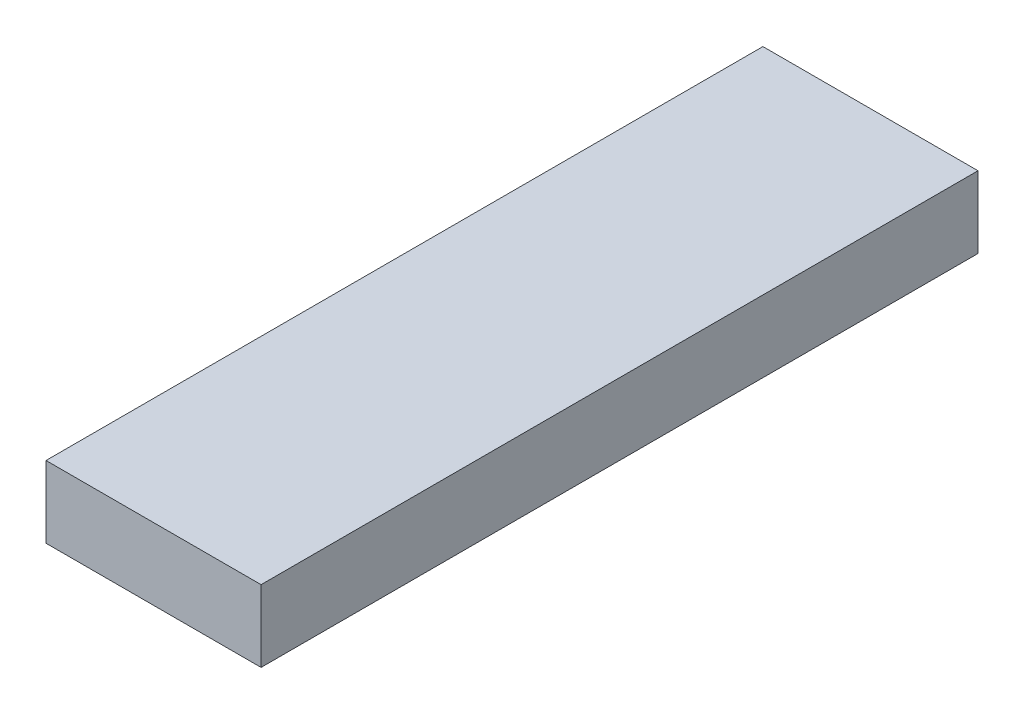
ISO-10303-21;
HEADER;
FILE_DESCRIPTION(('STEP AP214'),'2;1');
FILE_NAME('part.step','',(''),(''),'','','');
FILE_SCHEMA(('AUTOMOTIVE_DESIGN { 1 0 10303 214 1 1 1 1 }'));
ENDSEC;
DATA;
#1=APPLICATION_CONTEXT('core data for automotive mechanical design processes');
#2=APPLICATION_PROTOCOL_DEFINITION('international standard','automotive_design',2000,#1);
#3=PRODUCT_CONTEXT('',#1,'mechanical');
#4=PRODUCT('Part','Part','',(#3));
#5=PRODUCT_RELATED_PRODUCT_CATEGORY('part','',(#4));
#6=PRODUCT_DEFINITION_FORMATION('','',#4);
#7=PRODUCT_DEFINITION_CONTEXT('part definition',#1,'design');
#8=PRODUCT_DEFINITION('design','',#6,#7);
#9=PRODUCT_DEFINITION_SHAPE('','',#8);
#10=(LENGTH_UNIT() NAMED_UNIT(*) SI_UNIT(.MILLI.,.METRE.));
#11=(NAMED_UNIT(*) PLANE_ANGLE_UNIT() SI_UNIT($,.RADIAN.));
#12=(NAMED_UNIT(*) SI_UNIT($,.STERADIAN.) SOLID_ANGLE_UNIT());
#13=UNCERTAINTY_MEASURE_WITH_UNIT(LENGTH_MEASURE(1.E-05),#10,'distance_accuracy_value','');
#14=(GEOMETRIC_REPRESENTATION_CONTEXT(3) GLOBAL_UNCERTAINTY_ASSIGNED_CONTEXT((#13)) GLOBAL_UNIT_ASSIGNED_CONTEXT((#10,
#11,#12)) REPRESENTATION_CONTEXT('',''));
#15=CARTESIAN_POINT('',(0.,0.,0.));
#16=DIRECTION('',(0.,0.,1.));
#17=DIRECTION('',(1.,0.,0.));
#18=AXIS2_PLACEMENT_3D('',#15,#16,#17);
#19=CARTESIAN_POINT('',(90.,-30.,600.));
#20=DIRECTION('',(-1.,0.,0.));
#21=DIRECTION('',(0.,0.,1.));
#22=AXIS2_PLACEMENT_3D('',#19,#20,#21);
#23=PLANE('',#22);
#24=DIRECTION('',(0.,1.,0.));
#25=VECTOR('',#24,1.);
#26=CARTESIAN_POINT('',(90.,-30.,0.));
#27=LINE('',#26,#25);
#28=CARTESIAN_POINT('',(90.,-30.,0.));
#29=VERTEX_POINT('',#28);
#30=CARTESIAN_POINT('',(90.,30.,0.));
#31=VERTEX_POINT('',#30);
#32=EDGE_CURVE('E98',#29,#31,#27,.T.);
#33=ORIENTED_EDGE('',*,*,#32,.T.);
#34=DIRECTION('',(0.,0.,-1.));
#35=VECTOR('',#34,1.);
#36=CARTESIAN_POINT('',(90.,30.,600.));
#37=LINE('',#36,#35);
#38=CARTESIAN_POINT('',(90.,30.,600.));
#39=VERTEX_POINT('',#38);
#40=EDGE_CURVE('E11',#39,#31,#37,.T.);
#41=ORIENTED_EDGE('',*,*,#40,.F.);
#42=DIRECTION('',(0.,1.,0.));
#43=VECTOR('',#42,1.);
#44=CARTESIAN_POINT('',(90.,-30.,600.));
#45=LINE('',#44,#43);
#46=CARTESIAN_POINT('',(90.,-30.,600.));
#47=VERTEX_POINT('',#46);
#48=EDGE_CURVE('E86',#47,#39,#45,.T.);
#49=ORIENTED_EDGE('',*,*,#48,.F.);
#50=DIRECTION('',(0.,0.,-1.));
#51=VECTOR('',#50,1.);
#52=CARTESIAN_POINT('',(90.,-30.,600.));
#53=LINE('',#52,#51);
#54=EDGE_CURVE('E94',#47,#29,#53,.T.);
#55=ORIENTED_EDGE('',*,*,#54,.T.);
#56=EDGE_LOOP('',(#33,#41,#49,#55));
#57=FACE_BOUND('',#56,.T.);
#58=ADVANCED_FACE('F35',(#57),#23,.F.);
#59=CARTESIAN_POINT('',(-90.,30.,600.));
#60=DIRECTION('',(0.,-1.,0.));
#61=DIRECTION('',(0.,0.,-1.));
#62=AXIS2_PLACEMENT_3D('',#59,#60,#61);
#63=PLANE('',#62);
#64=DIRECTION('',(-1.,0.,0.));
#65=VECTOR('',#64,1.);
#66=CARTESIAN_POINT('',(-90.,30.,0.));
#67=LINE('',#66,#65);
#68=CARTESIAN_POINT('',(-90.,30.,0.));
#69=VERTEX_POINT('',#68);
#70=EDGE_CURVE('E90',#31,#69,#67,.T.);
#71=ORIENTED_EDGE('',*,*,#70,.T.);
#72=DIRECTION('',(0.,0.,-1.));
#73=VECTOR('',#72,1.);
#74=CARTESIAN_POINT('',(-90.,30.,600.));
#75=LINE('',#74,#73);
#76=CARTESIAN_POINT('',(-90.,30.,600.));
#77=VERTEX_POINT('',#76);
#78=EDGE_CURVE('E43',#77,#69,#75,.T.);
#79=ORIENTED_EDGE('',*,*,#78,.F.);
#80=DIRECTION('',(-1.,0.,0.));
#81=VECTOR('',#80,1.);
#82=CARTESIAN_POINT('',(-90.,30.,600.));
#83=LINE('',#82,#81);
#84=EDGE_CURVE('E81',#39,#77,#83,.T.);
#85=ORIENTED_EDGE('',*,*,#84,.F.);
#86=ORIENTED_EDGE('',*,*,#40,.T.);
#87=EDGE_LOOP('',(#71,#79,#85,#86));
#88=FACE_BOUND('',#87,.T.);
#89=ADVANCED_FACE('F89',(#88),#63,.F.);
#90=CARTESIAN_POINT('',(-90.,-30.,600.));
#91=DIRECTION('',(1.,0.,0.));
#92=DIRECTION('',(0.,0.,-1.));
#93=AXIS2_PLACEMENT_3D('',#90,#91,#92);
#94=PLANE('',#93);
#95=DIRECTION('',(0.,-1.,0.));
#96=VECTOR('',#95,1.);
#97=CARTESIAN_POINT('',(-90.,-30.,0.));
#98=LINE('',#97,#96);
#99=CARTESIAN_POINT('',(-90.,-30.,0.));
#100=VERTEX_POINT('',#99);
#101=EDGE_CURVE('E68',#69,#100,#98,.T.);
#102=ORIENTED_EDGE('',*,*,#101,.T.);
#103=DIRECTION('',(0.,0.,-1.));
#104=VECTOR('',#103,1.);
#105=CARTESIAN_POINT('',(-90.,-30.,600.));
#106=LINE('',#105,#104);
#107=CARTESIAN_POINT('',(-90.,-30.,600.));
#108=VERTEX_POINT('',#107);
#109=EDGE_CURVE('E91',#108,#100,#106,.T.);
#110=ORIENTED_EDGE('',*,*,#109,.F.);
#111=DIRECTION('',(0.,-1.,0.));
#112=VECTOR('',#111,1.);
#113=CARTESIAN_POINT('',(-90.,-30.,600.));
#114=LINE('',#113,#112);
#115=EDGE_CURVE('E84',#77,#108,#114,.T.);
#116=ORIENTED_EDGE('',*,*,#115,.F.);
#117=ORIENTED_EDGE('',*,*,#78,.T.);
#118=EDGE_LOOP('',(#102,#110,#116,#117));
#119=FACE_BOUND('',#118,.T.);
#120=ADVANCED_FACE('F92',(#119),#94,.F.);
#121=CARTESIAN_POINT('',(-90.,-30.,600.));
#122=DIRECTION('',(0.,1.,0.));
#123=DIRECTION('',(0.,0.,1.));
#124=AXIS2_PLACEMENT_3D('',#121,#122,#123);
#125=PLANE('',#124);
#126=DIRECTION('',(1.,0.,0.));
#127=VECTOR('',#126,1.);
#128=CARTESIAN_POINT('',(-90.,-30.,0.));
#129=LINE('',#128,#127);
#130=EDGE_CURVE('E74',#100,#29,#129,.T.);
#131=ORIENTED_EDGE('',*,*,#130,.T.);
#132=ORIENTED_EDGE('',*,*,#54,.F.);
#133=DIRECTION('',(1.,0.,0.));
#134=VECTOR('',#133,1.);
#135=CARTESIAN_POINT('',(-90.,-30.,600.));
#136=LINE('',#135,#134);
#137=EDGE_CURVE('E51',#108,#47,#136,.T.);
#138=ORIENTED_EDGE('',*,*,#137,.F.);
#139=ORIENTED_EDGE('',*,*,#109,.T.);
#140=EDGE_LOOP('',(#131,#132,#138,#139));
#141=FACE_BOUND('',#140,.T.);
#142=ADVANCED_FACE('F105',(#141),#125,.F.);
#143=CARTESIAN_POINT('',(0.,0.,600.));
#144=DIRECTION('',(0.,0.,-1.));
#145=DIRECTION('',(-1.,0.,0.));
#146=AXIS2_PLACEMENT_3D('',#143,#144,#145);
#147=PLANE('',#146);
#148=ORIENTED_EDGE('',*,*,#48,.T.);
#149=ORIENTED_EDGE('',*,*,#84,.T.);
#150=ORIENTED_EDGE('',*,*,#115,.T.);
#151=ORIENTED_EDGE('',*,*,#137,.T.);
#152=EDGE_LOOP('',(#148,#149,#150,#151));
#153=FACE_BOUND('',#152,.T.);
#154=ADVANCED_FACE('F82',(#153),#147,.F.);
#155=CARTESIAN_POINT('',(0.,0.,0.));
#156=DIRECTION('',(0.,0.,-1.));
#157=DIRECTION('',(-1.,0.,0.));
#158=AXIS2_PLACEMENT_3D('',#155,#156,#157);
#159=PLANE('',#158);
#160=ORIENTED_EDGE('',*,*,#32,.F.);
#161=ORIENTED_EDGE('',*,*,#130,.F.);
#162=ORIENTED_EDGE('',*,*,#101,.F.);
#163=ORIENTED_EDGE('',*,*,#70,.F.);
#164=EDGE_LOOP('',(#160,#161,#162,#163));
#165=FACE_BOUND('',#164,.T.);
#166=ADVANCED_FACE('F108',(#165),#159,.T.);
#167=CLOSED_SHELL('',(#58,#89,#120,#142,#154,#166));
#168=MANIFOLD_SOLID_BREP('B2',#167);
#169=ADVANCED_BREP_SHAPE_REPRESENTATION('',(#18,#168),#14);
#170=SHAPE_DEFINITION_REPRESENTATION(#9,#169);
ENDSEC;
END-ISO-10303-21;
